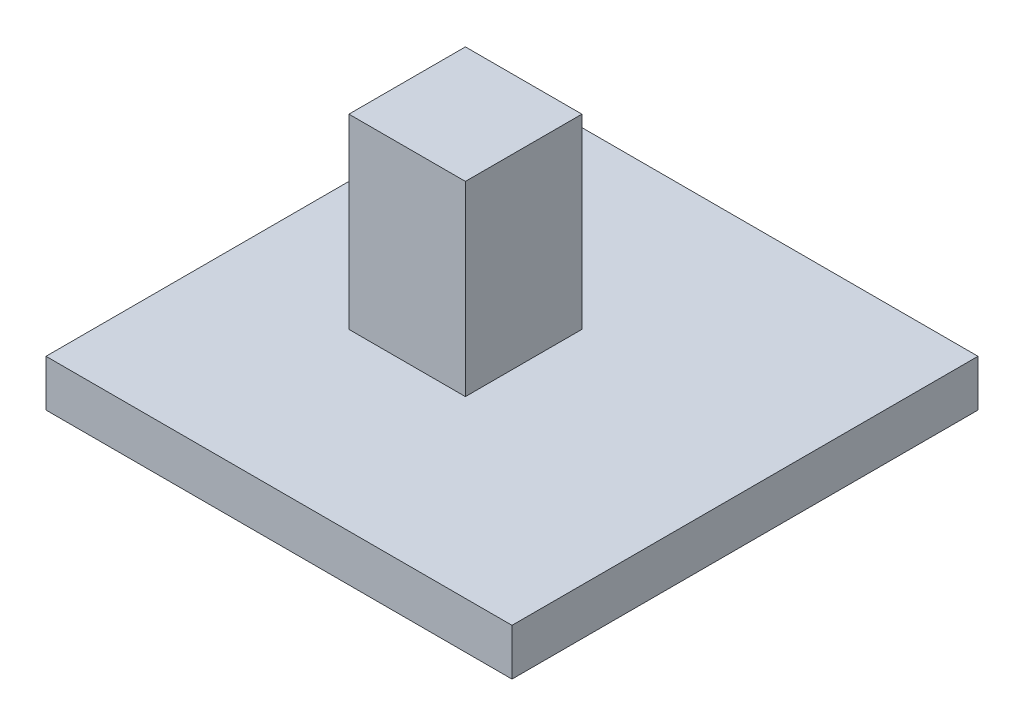
ISO-10303-21;
HEADER;
FILE_DESCRIPTION(('STEP AP214'),'2;1');
FILE_NAME('part.step','',(''),(''),'','','');
FILE_SCHEMA(('AUTOMOTIVE_DESIGN { 1 0 10303 214 1 1 1 1 }'));
ENDSEC;
DATA;
#1=APPLICATION_CONTEXT('core data for automotive mechanical design processes');
#2=APPLICATION_PROTOCOL_DEFINITION('international standard','automotive_design',2000,#1);
#3=PRODUCT_CONTEXT('',#1,'mechanical');
#4=PRODUCT('Part','Part','',(#3));
#5=PRODUCT_RELATED_PRODUCT_CATEGORY('part','',(#4));
#6=PRODUCT_DEFINITION_FORMATION('','',#4);
#7=PRODUCT_DEFINITION_CONTEXT('part definition',#1,'design');
#8=PRODUCT_DEFINITION('design','',#6,#7);
#9=PRODUCT_DEFINITION_SHAPE('','',#8);
#10=(LENGTH_UNIT() NAMED_UNIT(*) SI_UNIT(.MILLI.,.METRE.));
#11=(NAMED_UNIT(*) PLANE_ANGLE_UNIT() SI_UNIT($,.RADIAN.));
#12=(NAMED_UNIT(*) SI_UNIT($,.STERADIAN.) SOLID_ANGLE_UNIT());
#13=UNCERTAINTY_MEASURE_WITH_UNIT(LENGTH_MEASURE(1.E-05),#10,'distance_accuracy_value','');
#14=(GEOMETRIC_REPRESENTATION_CONTEXT(3) GLOBAL_UNCERTAINTY_ASSIGNED_CONTEXT((#13)) GLOBAL_UNIT_ASSIGNED_CONTEXT((#10,
#11,#12)) REPRESENTATION_CONTEXT('',''));
#15=CARTESIAN_POINT('',(0.,0.,0.));
#16=DIRECTION('',(0.,0.,1.));
#17=DIRECTION('',(1.,0.,0.));
#18=AXIS2_PLACEMENT_3D('',#15,#16,#17);
#19=CARTESIAN_POINT('',(0.,20.,0.));
#20=DIRECTION('',(0.,1.,0.));
#21=DIRECTION('',(0.,0.,1.));
#22=AXIS2_PLACEMENT_3D('',#19,#20,#21);
#23=PLANE('',#22);
#24=DIRECTION('',(0.,0.,-1.));
#25=VECTOR('',#24,1.);
#26=CARTESIAN_POINT('',(99.9999999999999,20.,-100.));
#27=LINE('',#26,#25);
#28=CARTESIAN_POINT('',(100.,20.,100.));
#29=VERTEX_POINT('',#28);
#30=CARTESIAN_POINT('',(99.9999999999999,20.,-100.));
#31=VERTEX_POINT('',#30);
#32=EDGE_CURVE('E148',#29,#31,#27,.T.);
#33=ORIENTED_EDGE('',*,*,#32,.T.);
#34=DIRECTION('',(-1.,0.,0.));
#35=VECTOR('',#34,1.);
#36=CARTESIAN_POINT('',(-100.,20.,-100.));
#37=LINE('',#36,#35);
#38=CARTESIAN_POINT('',(-100.,20.,-100.));
#39=VERTEX_POINT('',#38);
#40=EDGE_CURVE('E91',#31,#39,#37,.T.);
#41=ORIENTED_EDGE('',*,*,#40,.T.);
#42=DIRECTION('',(0.,0.,1.));
#43=VECTOR('',#42,1.);
#44=CARTESIAN_POINT('',(-100.,20.,-100.));
#45=LINE('',#44,#43);
#46=CARTESIAN_POINT('',(-100.,20.,100.));
#47=VERTEX_POINT('',#46);
#48=EDGE_CURVE('E151',#39,#47,#45,.T.);
#49=ORIENTED_EDGE('',*,*,#48,.T.);
#50=DIRECTION('',(1.,0.,0.));
#51=VECTOR('',#50,1.);
#52=CARTESIAN_POINT('',(-100.,20.,100.));
#53=LINE('',#52,#51);
#54=EDGE_CURVE('E63',#47,#29,#53,.T.);
#55=ORIENTED_EDGE('',*,*,#54,.T.);
#56=EDGE_LOOP('',(#33,#41,#49,#55));
#57=FACE_BOUND('',#56,.T.);
#58=DIRECTION('',(0.,0.,-1.));
#59=VECTOR('',#58,1.);
#60=CARTESIAN_POINT('',(5.00000000000063,20.,25.0000000000005));
#61=LINE('',#60,#59);
#62=CARTESIAN_POINT('',(5.00000000000063,20.,25.0000000000005));
#63=VERTEX_POINT('',#62);
#64=CARTESIAN_POINT('',(5.00000000000063,20.,-24.9999999999995));
#65=VERTEX_POINT('',#64);
#66=EDGE_CURVE('E129',#63,#65,#61,.T.);
#67=ORIENTED_EDGE('',*,*,#66,.F.);
#68=DIRECTION('',(1.,0.,0.));
#69=VECTOR('',#68,1.);
#70=CARTESIAN_POINT('',(-44.9999999999994,20.,25.0000000000005));
#71=LINE('',#70,#69);
#72=CARTESIAN_POINT('',(-44.9999999999994,20.,25.0000000000005));
#73=VERTEX_POINT('',#72);
#74=EDGE_CURVE('E54',#73,#63,#71,.T.);
#75=ORIENTED_EDGE('',*,*,#74,.F.);
#76=DIRECTION('',(0.,0.,1.));
#77=VECTOR('',#76,1.);
#78=CARTESIAN_POINT('',(-44.9999999999994,20.,25.0000000000005));
#79=LINE('',#78,#77);
#80=CARTESIAN_POINT('',(-44.9999999999994,20.,-24.9999999999995));
#81=VERTEX_POINT('',#80);
#82=EDGE_CURVE('E135',#81,#73,#79,.T.);
#83=ORIENTED_EDGE('',*,*,#82,.F.);
#84=DIRECTION('',(-1.,0.,0.));
#85=VECTOR('',#84,1.);
#86=CARTESIAN_POINT('',(-44.9999999999994,20.,-24.9999999999995));
#87=LINE('',#86,#85);
#88=EDGE_CURVE('E120',#65,#81,#87,.T.);
#89=ORIENTED_EDGE('',*,*,#88,.F.);
#90=EDGE_LOOP('',(#67,#75,#83,#89));
#91=FACE_BOUND('',#90,.T.);
#92=ADVANCED_FACE('F39',(#57,#91),#23,.T.);
#93=CARTESIAN_POINT('',(99.9999999999999,20.,-100.));
#94=DIRECTION('',(-1.,0.,0.));
#95=DIRECTION('',(0.,0.,1.));
#96=AXIS2_PLACEMENT_3D('',#93,#94,#95);
#97=PLANE('',#96);
#98=DIRECTION('',(0.,0.,-1.));
#99=VECTOR('',#98,1.);
#100=CARTESIAN_POINT('',(99.9999999999999,0.,-100.));
#101=LINE('',#100,#99);
#102=CARTESIAN_POINT('',(100.,0.,100.));
#103=VERTEX_POINT('',#102);
#104=CARTESIAN_POINT('',(99.9999999999999,0.,-100.));
#105=VERTEX_POINT('',#104);
#106=EDGE_CURVE('E155',#103,#105,#101,.T.);
#107=ORIENTED_EDGE('',*,*,#106,.T.);
#108=DIRECTION('',(0.,-1.,0.));
#109=VECTOR('',#108,1.);
#110=CARTESIAN_POINT('',(99.9999999999999,20.,-100.));
#111=LINE('',#110,#109);
#112=EDGE_CURVE('E11',#31,#105,#111,.T.);
#113=ORIENTED_EDGE('',*,*,#112,.F.);
#114=ORIENTED_EDGE('',*,*,#32,.F.);
#115=DIRECTION('',(0.,-1.,0.));
#116=VECTOR('',#115,1.);
#117=CARTESIAN_POINT('',(100.,20.,100.));
#118=LINE('',#117,#116);
#119=EDGE_CURVE('E154',#29,#103,#118,.T.);
#120=ORIENTED_EDGE('',*,*,#119,.T.);
#121=EDGE_LOOP('',(#107,#113,#114,#120));
#122=FACE_BOUND('',#121,.T.);
#123=ADVANCED_FACE('F41',(#122),#97,.F.);
#124=CARTESIAN_POINT('',(-100.,20.,-100.));
#125=DIRECTION('',(0.,0.,1.));
#126=DIRECTION('',(1.,0.,0.));
#127=AXIS2_PLACEMENT_3D('',#124,#125,#126);
#128=PLANE('',#127);
#129=DIRECTION('',(-1.,0.,0.));
#130=VECTOR('',#129,1.);
#131=CARTESIAN_POINT('',(-100.,0.,-100.));
#132=LINE('',#131,#130);
#133=CARTESIAN_POINT('',(-100.,0.,-100.));
#134=VERTEX_POINT('',#133);
#135=EDGE_CURVE('E158',#105,#134,#132,.T.);
#136=ORIENTED_EDGE('',*,*,#135,.T.);
#137=DIRECTION('',(0.,-1.,0.));
#138=VECTOR('',#137,1.);
#139=CARTESIAN_POINT('',(-100.,20.,-100.));
#140=LINE('',#139,#138);
#141=EDGE_CURVE('E47',#39,#134,#140,.T.);
#142=ORIENTED_EDGE('',*,*,#141,.F.);
#143=ORIENTED_EDGE('',*,*,#40,.F.);
#144=ORIENTED_EDGE('',*,*,#112,.T.);
#145=EDGE_LOOP('',(#136,#142,#143,#144));
#146=FACE_BOUND('',#145,.T.);
#147=ADVANCED_FACE('F187',(#146),#128,.F.);
#148=CARTESIAN_POINT('',(-100.,20.,-100.));
#149=DIRECTION('',(1.,0.,0.));
#150=DIRECTION('',(0.,0.,-1.));
#151=AXIS2_PLACEMENT_3D('',#148,#149,#150);
#152=PLANE('',#151);
#153=DIRECTION('',(0.,0.,1.));
#154=VECTOR('',#153,1.);
#155=CARTESIAN_POINT('',(-100.,0.,-100.));
#156=LINE('',#155,#154);
#157=CARTESIAN_POINT('',(-100.,0.,100.));
#158=VERTEX_POINT('',#157);
#159=EDGE_CURVE('E161',#134,#158,#156,.T.);
#160=ORIENTED_EDGE('',*,*,#159,.T.);
#161=DIRECTION('',(0.,-1.,0.));
#162=VECTOR('',#161,1.);
#163=CARTESIAN_POINT('',(-100.,20.,100.));
#164=LINE('',#163,#162);
#165=EDGE_CURVE('E165',#47,#158,#164,.T.);
#166=ORIENTED_EDGE('',*,*,#165,.F.);
#167=ORIENTED_EDGE('',*,*,#48,.F.);
#168=ORIENTED_EDGE('',*,*,#141,.T.);
#169=EDGE_LOOP('',(#160,#166,#167,#168));
#170=FACE_BOUND('',#169,.T.);
#171=ADVANCED_FACE('F170',(#170),#152,.F.);
#172=CARTESIAN_POINT('',(-100.,20.,100.));
#173=DIRECTION('',(0.,0.,-1.));
#174=DIRECTION('',(-1.,0.,0.));
#175=AXIS2_PLACEMENT_3D('',#172,#173,#174);
#176=PLANE('',#175);
#177=DIRECTION('',(1.,0.,0.));
#178=VECTOR('',#177,1.);
#179=CARTESIAN_POINT('',(-100.,0.,100.));
#180=LINE('',#179,#178);
#181=EDGE_CURVE('E84',#158,#103,#180,.T.);
#182=ORIENTED_EDGE('',*,*,#181,.T.);
#183=ORIENTED_EDGE('',*,*,#119,.F.);
#184=ORIENTED_EDGE('',*,*,#54,.F.);
#185=ORIENTED_EDGE('',*,*,#165,.T.);
#186=EDGE_LOOP('',(#182,#183,#184,#185));
#187=FACE_BOUND('',#186,.T.);
#188=ADVANCED_FACE('F178',(#187),#176,.F.);
#189=CARTESIAN_POINT('',(0.,0.,0.));
#190=DIRECTION('',(0.,1.,0.));
#191=DIRECTION('',(0.,0.,1.));
#192=AXIS2_PLACEMENT_3D('',#189,#190,#191);
#193=PLANE('',#192);
#194=ORIENTED_EDGE('',*,*,#106,.F.);
#195=ORIENTED_EDGE('',*,*,#181,.F.);
#196=ORIENTED_EDGE('',*,*,#159,.F.);
#197=ORIENTED_EDGE('',*,*,#135,.F.);
#198=EDGE_LOOP('',(#194,#195,#196,#197));
#199=FACE_BOUND('',#198,.T.);
#200=ADVANCED_FACE('F174',(#199),#193,.F.);
#201=CARTESIAN_POINT('',(-44.9999999999994,170.710678118656,25.0000000000005));
#202=DIRECTION('',(0.,0.,-1.));
#203=DIRECTION('',(-1.,0.,0.));
#204=AXIS2_PLACEMENT_3D('',#201,#202,#203);
#205=PLANE('',#204);
#206=DIRECTION('',(0.,-1.,0.));
#207=VECTOR('',#206,1.);
#208=CARTESIAN_POINT('',(5.00000000000063,170.710678118656,25.0000000000005));
#209=LINE('',#208,#207);
#210=CARTESIAN_POINT('',(5.00000000000062,100.000000000001,25.0000000000005));
#211=VERTEX_POINT('',#210);
#212=EDGE_CURVE('E131',#211,#63,#209,.T.);
#213=ORIENTED_EDGE('',*,*,#212,.F.);
#214=DIRECTION('',(-1.,0.,0.));
#215=VECTOR('',#214,1.);
#216=CARTESIAN_POINT('',(-44.9999999999994,100.000000000001,25.0000000000005));
#217=LINE('',#216,#215);
#218=CARTESIAN_POINT('',(-44.9999999999994,100.000000000001,25.0000000000005));
#219=VERTEX_POINT('',#218);
#220=EDGE_CURVE('E125',#211,#219,#217,.T.);
#221=ORIENTED_EDGE('',*,*,#220,.T.);
#222=DIRECTION('',(0.,-1.,0.));
#223=VECTOR('',#222,1.);
#224=CARTESIAN_POINT('',(-44.9999999999994,170.710678118656,25.0000000000005));
#225=LINE('',#224,#223);
#226=EDGE_CURVE('E142',#219,#73,#225,.T.);
#227=ORIENTED_EDGE('',*,*,#226,.T.);
#228=ORIENTED_EDGE('',*,*,#74,.T.);
#229=EDGE_LOOP('',(#213,#221,#227,#228));
#230=FACE_BOUND('',#229,.T.);
#231=ADVANCED_FACE('F185',(#230),#205,.F.);
#232=CARTESIAN_POINT('',(-44.9999999999994,170.710678118656,25.0000000000005));
#233=DIRECTION('',(1.,0.,0.));
#234=DIRECTION('',(0.,0.,-1.));
#235=AXIS2_PLACEMENT_3D('',#232,#233,#234);
#236=PLANE('',#235);
#237=ORIENTED_EDGE('',*,*,#226,.F.);
#238=DIRECTION('',(0.,0.,-1.));
#239=VECTOR('',#238,1.);
#240=CARTESIAN_POINT('',(-44.9999999999994,100.000000000001,25.0000000000005));
#241=LINE('',#240,#239);
#242=CARTESIAN_POINT('',(-44.9999999999994,100.000000000001,-24.9999999999995));
#243=VERTEX_POINT('',#242);
#244=EDGE_CURVE('E147',#219,#243,#241,.T.);
#245=ORIENTED_EDGE('',*,*,#244,.T.);
#246=DIRECTION('',(0.,-1.,0.));
#247=VECTOR('',#246,1.);
#248=CARTESIAN_POINT('',(-44.9999999999994,170.710678118656,-24.9999999999995));
#249=LINE('',#248,#247);
#250=EDGE_CURVE('E126',#243,#81,#249,.T.);
#251=ORIENTED_EDGE('',*,*,#250,.T.);
#252=ORIENTED_EDGE('',*,*,#82,.T.);
#253=EDGE_LOOP('',(#237,#245,#251,#252));
#254=FACE_BOUND('',#253,.T.);
#255=ADVANCED_FACE('F202',(#254),#236,.F.);
#256=CARTESIAN_POINT('',(-44.9999999999994,170.710678118656,-24.9999999999995));
#257=DIRECTION('',(0.,0.,1.));
#258=DIRECTION('',(1.,0.,0.));
#259=AXIS2_PLACEMENT_3D('',#256,#257,#258);
#260=PLANE('',#259);
#261=ORIENTED_EDGE('',*,*,#250,.F.);
#262=DIRECTION('',(1.,0.,0.));
#263=VECTOR('',#262,1.);
#264=CARTESIAN_POINT('',(-44.9999999999994,100.000000000001,-24.9999999999995));
#265=LINE('',#264,#263);
#266=CARTESIAN_POINT('',(5.00000000000062,100.000000000001,-24.9999999999995));
#267=VERTEX_POINT('',#266);
#268=EDGE_CURVE('E122',#243,#267,#265,.T.);
#269=ORIENTED_EDGE('',*,*,#268,.T.);
#270=DIRECTION('',(0.,-1.,0.));
#271=VECTOR('',#270,1.);
#272=CARTESIAN_POINT('',(5.00000000000063,170.710678118656,-24.9999999999995));
#273=LINE('',#272,#271);
#274=EDGE_CURVE('E115',#267,#65,#273,.T.);
#275=ORIENTED_EDGE('',*,*,#274,.T.);
#276=ORIENTED_EDGE('',*,*,#88,.T.);
#277=EDGE_LOOP('',(#261,#269,#275,#276));
#278=FACE_BOUND('',#277,.T.);
#279=ADVANCED_FACE('F118',(#278),#260,.F.);
#280=CARTESIAN_POINT('',(5.00000000000063,170.710678118656,25.0000000000005));
#281=DIRECTION('',(-1.,0.,0.));
#282=DIRECTION('',(0.,0.,1.));
#283=AXIS2_PLACEMENT_3D('',#280,#281,#282);
#284=PLANE('',#283);
#285=ORIENTED_EDGE('',*,*,#274,.F.);
#286=DIRECTION('',(0.,0.,1.));
#287=VECTOR('',#286,1.);
#288=CARTESIAN_POINT('',(5.00000000000063,100.000000000001,25.0000000000005));
#289=LINE('',#288,#287);
#290=EDGE_CURVE('E159',#267,#211,#289,.T.);
#291=ORIENTED_EDGE('',*,*,#290,.T.);
#292=ORIENTED_EDGE('',*,*,#212,.T.);
#293=ORIENTED_EDGE('',*,*,#66,.T.);
#294=EDGE_LOOP('',(#285,#291,#292,#293));
#295=FACE_BOUND('',#294,.T.);
#296=ADVANCED_FACE('F130',(#295),#284,.F.);
#297=CARTESIAN_POINT('',(-28.1477297751346,100.000000000001,24.8279122186119));
#298=DIRECTION('',(0.,-1.,0.));
#299=DIRECTION('',(0.707106781186556,0.,-0.707106781186539));
#300=AXIS2_PLACEMENT_3D('',#297,#298,#299);
#301=PLANE('',#300);
#302=ORIENTED_EDGE('',*,*,#268,.F.);
#303=ORIENTED_EDGE('',*,*,#244,.F.);
#304=ORIENTED_EDGE('',*,*,#220,.F.);
#305=ORIENTED_EDGE('',*,*,#290,.F.);
#306=EDGE_LOOP('',(#302,#303,#304,#305));
#307=FACE_BOUND('',#306,.T.);
#308=ADVANCED_FACE('F199',(#307),#301,.F.);
#309=CLOSED_SHELL('',(#92,#123,#147,#171,#188,#200,#231,#255,#279,#296,#308));
#310=MANIFOLD_SOLID_BREP('B2',#309);
#311=ADVANCED_BREP_SHAPE_REPRESENTATION('',(#18,#310),#14);
#312=SHAPE_DEFINITION_REPRESENTATION(#9,#311);
ENDSEC;
END-ISO-10303-21;
